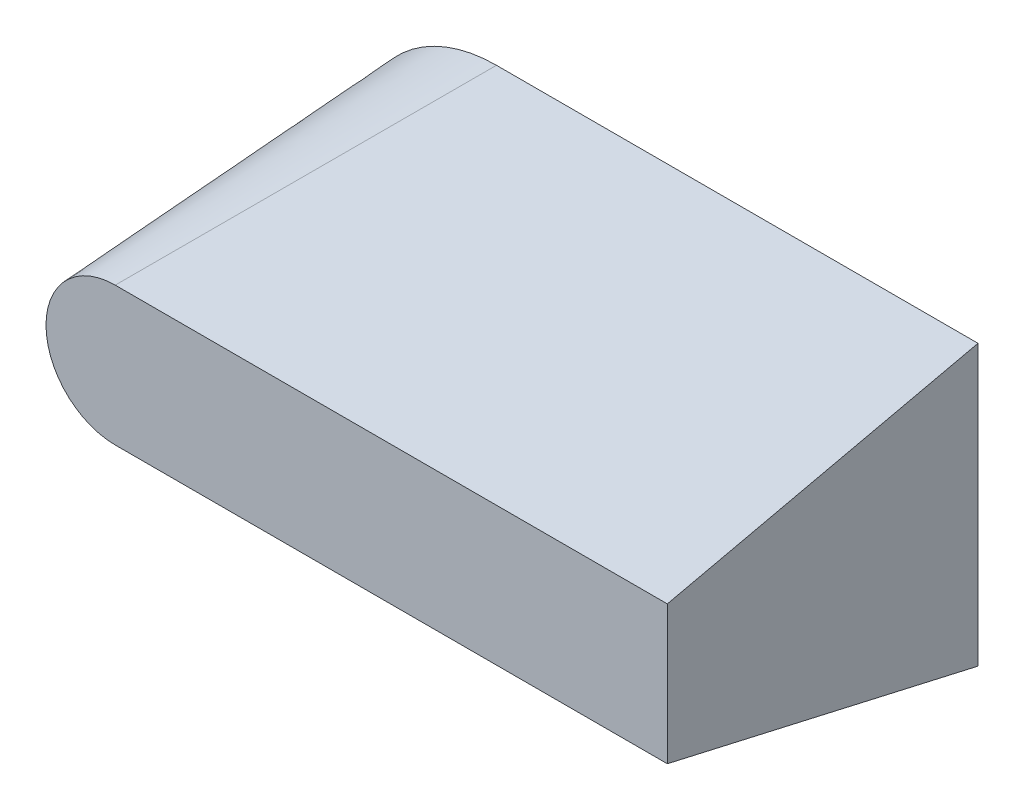
ISO-10303-21;
HEADER;
FILE_DESCRIPTION(('STEP AP214'),'2;1');
FILE_NAME('part.step','',(''),(''),'','','');
FILE_SCHEMA(('AUTOMOTIVE_DESIGN { 1 0 10303 214 1 1 1 1 }'));
ENDSEC;
DATA;
#1=APPLICATION_CONTEXT('core data for automotive mechanical design processes');
#2=APPLICATION_PROTOCOL_DEFINITION('international standard','automotive_design',2000,#1);
#3=PRODUCT_CONTEXT('',#1,'mechanical');
#4=PRODUCT('Part','Part','',(#3));
#5=PRODUCT_RELATED_PRODUCT_CATEGORY('part','',(#4));
#6=PRODUCT_DEFINITION_FORMATION('','',#4);
#7=PRODUCT_DEFINITION_CONTEXT('part definition',#1,'design');
#8=PRODUCT_DEFINITION('design','',#6,#7);
#9=PRODUCT_DEFINITION_SHAPE('','',#8);
#10=(LENGTH_UNIT() NAMED_UNIT(*) SI_UNIT(.MILLI.,.METRE.));
#11=(NAMED_UNIT(*) PLANE_ANGLE_UNIT() SI_UNIT($,.RADIAN.));
#12=(NAMED_UNIT(*) SI_UNIT($,.STERADIAN.) SOLID_ANGLE_UNIT());
#13=UNCERTAINTY_MEASURE_WITH_UNIT(LENGTH_MEASURE(1.E-05),#10,'distance_accuracy_value','');
#14=(GEOMETRIC_REPRESENTATION_CONTEXT(3) GLOBAL_UNCERTAINTY_ASSIGNED_CONTEXT((#13)) GLOBAL_UNIT_ASSIGNED_CONTEXT((#10,
#11,#12)) REPRESENTATION_CONTEXT('',''));
#15=CARTESIAN_POINT('',(0.,0.,0.));
#16=DIRECTION('',(0.,0.,1.));
#17=DIRECTION('',(1.,0.,0.));
#18=AXIS2_PLACEMENT_3D('',#15,#16,#17);
#19=CARTESIAN_POINT('',(3.345,2.8439635,0.));
#20=DIRECTION('',(0.,0.975007651297412,-0.222171285074163));
#21=DIRECTION('',(-1.,0.,0.));
#22=AXIS2_PLACEMENT_3D('',#19,#20,#21);
#23=PLANE('',#22);
#24=DIRECTION('',(1.,0.,0.));
#25=VECTOR('',#24,1.);
#26=CARTESIAN_POINT('',(3.19,2.8439635,0.));
#27=LINE('',#26,#25);
#28=CARTESIAN_POINT('',(3.19,2.8439635,0.));
#29=VERTEX_POINT('',#28);
#30=CARTESIAN_POINT('',(3.5,2.8439635,0.));
#31=VERTEX_POINT('',#30);
#32=EDGE_CURVE('E70',#29,#31,#27,.T.);
#33=ORIENTED_EDGE('',*,*,#32,.T.);
#34=DIRECTION('',(0.,0.222171285074163,0.975007651297412));
#35=VECTOR('',#34,1.);
#36=CARTESIAN_POINT('',(3.5,2.8439635,0.));
#37=LINE('',#36,#35);
#38=CARTESIAN_POINT('',(3.5,2.889536739303,0.2));
#39=VERTEX_POINT('',#38);
#40=EDGE_CURVE('E11',#31,#39,#37,.T.);
#41=ORIENTED_EDGE('',*,*,#40,.T.);
#42=DIRECTION('',(1.,0.,0.));
#43=VECTOR('',#42,1.);
#44=CARTESIAN_POINT('',(3.144571,2.889536739303,0.2));
#45=LINE('',#44,#43);
#46=CARTESIAN_POINT('',(3.144571,2.889536739303,0.2));
#47=VERTEX_POINT('',#46);
#48=EDGE_CURVE('E73',#47,#39,#45,.T.);
#49=ORIENTED_EDGE('',*,*,#48,.F.);
#50=DIRECTION('',(-0.216228780647909,0.216915317631095,0.951941626044643));
#51=VECTOR('',#50,1.);
#52=CARTESIAN_POINT('',(3.19,2.8439635,0.));
#53=LINE('',#52,#51);
#54=EDGE_CURVE('E68',#29,#47,#53,.T.);
#55=ORIENTED_EDGE('',*,*,#54,.F.);
#56=EDGE_LOOP('',(#33,#41,#49,#55));
#57=FACE_BOUND('',#56,.T.);
#58=ADVANCED_FACE('F17',(#57),#23,.F.);
#59=CARTESIAN_POINT('',(3.5,2.9339635,0.));
#60=DIRECTION('',(-1.,0.,0.));
#61=DIRECTION('',(0.,0.,1.));
#62=AXIS2_PLACEMENT_3D('',#59,#60,#61);
#63=PLANE('',#62);
#64=DIRECTION('',(0.,1.,0.));
#65=VECTOR('',#64,1.);
#66=CARTESIAN_POINT('',(3.5,2.8439635,0.));
#67=LINE('',#66,#65);
#68=CARTESIAN_POINT('',(3.5,3.0239635,0.));
#69=VERTEX_POINT('',#68);
#70=EDGE_CURVE('E86',#31,#69,#67,.T.);
#71=ORIENTED_EDGE('',*,*,#70,.T.);
#72=DIRECTION('',(0.,-0.220835850174083,0.975310990032354));
#73=VECTOR('',#72,1.);
#74=CARTESIAN_POINT('',(3.5,3.0239635,0.));
#75=LINE('',#74,#73);
#76=CARTESIAN_POINT('',(3.5,2.978678282786,0.2));
#77=VERTEX_POINT('',#76);
#78=EDGE_CURVE('E26',#69,#77,#75,.T.);
#79=ORIENTED_EDGE('',*,*,#78,.T.);
#80=DIRECTION('',(0.,-1.,0.));
#81=VECTOR('',#80,1.);
#82=CARTESIAN_POINT('',(3.5,2.978678282786,0.2));
#83=LINE('',#82,#81);
#84=EDGE_CURVE('E20',#77,#39,#83,.T.);
#85=ORIENTED_EDGE('',*,*,#84,.T.);
#86=ORIENTED_EDGE('',*,*,#40,.F.);
#87=EDGE_LOOP('',(#71,#79,#85,#86));
#88=FACE_BOUND('',#87,.T.);
#89=ADVANCED_FACE('F117',(#88),#63,.F.);
#90=CARTESIAN_POINT('',(3.345,3.0239635,0.));
#91=DIRECTION('',(0.,-0.975310990032354,-0.220835850174083));
#92=DIRECTION('',(0.,0.220835850174083,-0.975310990032354));
#93=AXIS2_PLACEMENT_3D('',#90,#91,#92);
#94=PLANE('',#93);
#95=DIRECTION('',(-1.,0.,0.));
#96=VECTOR('',#95,1.);
#97=CARTESIAN_POINT('',(3.5,3.0239635,0.));
#98=LINE('',#97,#96);
#99=CARTESIAN_POINT('',(3.19,3.0239635,0.));
#100=VERTEX_POINT('',#99);
#101=EDGE_CURVE('E94',#69,#100,#98,.T.);
#102=ORIENTED_EDGE('',*,*,#101,.T.);
#103=DIRECTION('',(-0.216292905807355,-0.215608338755716,0.952223935404068));
#104=VECTOR('',#103,1.);
#105=CARTESIAN_POINT('',(3.19,3.0239635,0.));
#106=LINE('',#105,#104);
#107=CARTESIAN_POINT('',(3.144571,2.978678282786,0.2));
#108=VERTEX_POINT('',#107);
#109=EDGE_CURVE('E91',#100,#108,#106,.T.);
#110=ORIENTED_EDGE('',*,*,#109,.T.);
#111=DIRECTION('',(-1.,0.,0.));
#112=VECTOR('',#111,1.);
#113=CARTESIAN_POINT('',(3.5,2.978678282786,0.2));
#114=LINE('',#113,#112);
#115=EDGE_CURVE('E104',#77,#108,#114,.T.);
#116=ORIENTED_EDGE('',*,*,#115,.F.);
#117=ORIENTED_EDGE('',*,*,#78,.F.);
#118=EDGE_LOOP('',(#102,#110,#116,#117));
#119=FACE_BOUND('',#118,.T.);
#120=ADVANCED_FACE('F120',(#119),#94,.F.);
#121=CARTESIAN_POINT('',(3.310117201785,2.934107511044,0.2));
#122=DIRECTION('',(0.,0.,1.));
#123=DIRECTION('',(1.,0.,0.));
#124=AXIS2_PLACEMENT_3D('',#121,#122,#123);
#125=PLANE('',#124);
#126=CARTESIAN_POINT('',(3.144571,2.934107511044,0.2));
#127=DIRECTION('',(0.,0.,1.));
#128=DIRECTION('',(1.,0.,0.));
#129=AXIS2_PLACEMENT_3D('',#126,#127,#128);
#130=CIRCLE('',#129,0.0445707717413);
#131=EDGE_CURVE('E79',#108,#47,#130,.T.);
#132=ORIENTED_EDGE('',*,*,#131,.T.);
#133=ORIENTED_EDGE('',*,*,#48,.T.);
#134=ORIENTED_EDGE('',*,*,#84,.F.);
#135=ORIENTED_EDGE('',*,*,#115,.T.);
#136=EDGE_LOOP('',(#132,#133,#134,#135));
#137=FACE_BOUND('',#136,.T.);
#138=ADVANCED_FACE('F118',(#137),#125,.T.);
#139=CARTESIAN_POINT('',(3.19,2.8439635,0.));
#140=CARTESIAN_POINT('',(3.144571,2.889536739303,0.2));
#141=CARTESIAN_POINT('',(3.158584073464,2.8439635,0.));
#142=CARTESIAN_POINT('',(3.129012865659,2.889536739303,0.2));
#143=CARTESIAN_POINT('',(3.1271678209,2.856300471993,0.));
#144=CARTESIAN_POINT('',(3.113454569859,2.895647785775,0.2));
#145=CARTESIAN_POINT('',(3.10129085994,2.880974765303,0.));
#146=CARTESIAN_POINT('',(3.100639501855,2.907860465442,0.2));
#147=CARTESIAN_POINT('',(3.086478343262,2.915085405049,0.));
#148=CARTESIAN_POINT('',(3.093303887414,2.924768083308,0.2));
#149=CARTESIAN_POINT('',(3.086478343262,2.952841594951,0.));
#150=CARTESIAN_POINT('',(3.093303887414,2.943446938781,0.2));
#151=CARTESIAN_POINT('',(3.101290859939,2.986952234697,0.));
#152=CARTESIAN_POINT('',(3.100639501855,2.960354556646,0.2));
#153=CARTESIAN_POINT('',(3.1271678209,3.011626528007,0.));
#154=CARTESIAN_POINT('',(3.113454569859,2.972567236313,0.2));
#155=CARTESIAN_POINT('',(3.158584073464,3.0239635,0.));
#156=CARTESIAN_POINT('',(3.129012865659,2.978678282786,0.2));
#157=CARTESIAN_POINT('',(3.19,3.0239635,0.));
#158=CARTESIAN_POINT('',(3.144571,2.978678282786,0.2));
#159=(BOUNDED_SURFACE() B_SPLINE_SURFACE(9,1,((#139,#140),(#141,#142),(#143,#144),(#145,#146),
(#147,#148),(#149,#150),(#151,#152),(#153,#154),(#155,#156),(#157,#158)),.UNSPECIFIED.,.F.,.F.,
.F.) B_SPLINE_SURFACE_WITH_KNOTS((10,10),(2,2),(1.570796326795,4.712388980385),(0.,1.),
.UNSPECIFIED.) GEOMETRIC_REPRESENTATION_ITEM() RATIONAL_B_SPLINE_SURFACE(((1.,1.),(1.,1.),(1.,
1.),(1.,1.),(1.,1.),(1.,1.),(1.,1.),(1.,1.),(1.,1.),(1.,1.))) REPRESENTATION_ITEM('') SURFACE());
#160=CARTESIAN_POINT('',(3.19,2.9339635,0.));
#161=DIRECTION('',(0.,0.,-1.));
#162=DIRECTION('',(1.,0.,0.));
#163=AXIS2_PLACEMENT_3D('',#160,#161,#162);
#164=CIRCLE('',#163,0.09);
#165=EDGE_CURVE('E85',#29,#100,#164,.T.);
#166=ORIENTED_EDGE('',*,*,#165,.F.);
#167=ORIENTED_EDGE('',*,*,#54,.T.);
#168=ORIENTED_EDGE('',*,*,#131,.F.);
#169=ORIENTED_EDGE('',*,*,#109,.F.);
#170=EDGE_LOOP('',(#166,#167,#168,#169));
#171=FACE_BOUND('',#170,.T.);
#172=ADVANCED_FACE('F89',(#171),#159,.F.);
#173=CARTESIAN_POINT('',(3.318850830335,2.9339635,0.));
#174=DIRECTION('',(0.,0.,1.));
#175=DIRECTION('',(1.,0.,0.));
#176=AXIS2_PLACEMENT_3D('',#173,#174,#175);
#177=PLANE('',#176);
#178=ORIENTED_EDGE('',*,*,#165,.T.);
#179=ORIENTED_EDGE('',*,*,#101,.F.);
#180=ORIENTED_EDGE('',*,*,#70,.F.);
#181=ORIENTED_EDGE('',*,*,#32,.F.);
#182=EDGE_LOOP('',(#178,#179,#180,#181));
#183=FACE_BOUND('',#182,.T.);
#184=ADVANCED_FACE('F83',(#183),#177,.F.);
#185=CLOSED_SHELL('',(#58,#89,#120,#138,#172,#184));
#186=MANIFOLD_SOLID_BREP('B1',#185);
#187=ADVANCED_BREP_SHAPE_REPRESENTATION('',(#18,#186),#14);
#188=SHAPE_DEFINITION_REPRESENTATION(#9,#187);
ENDSEC;
END-ISO-10303-21;
